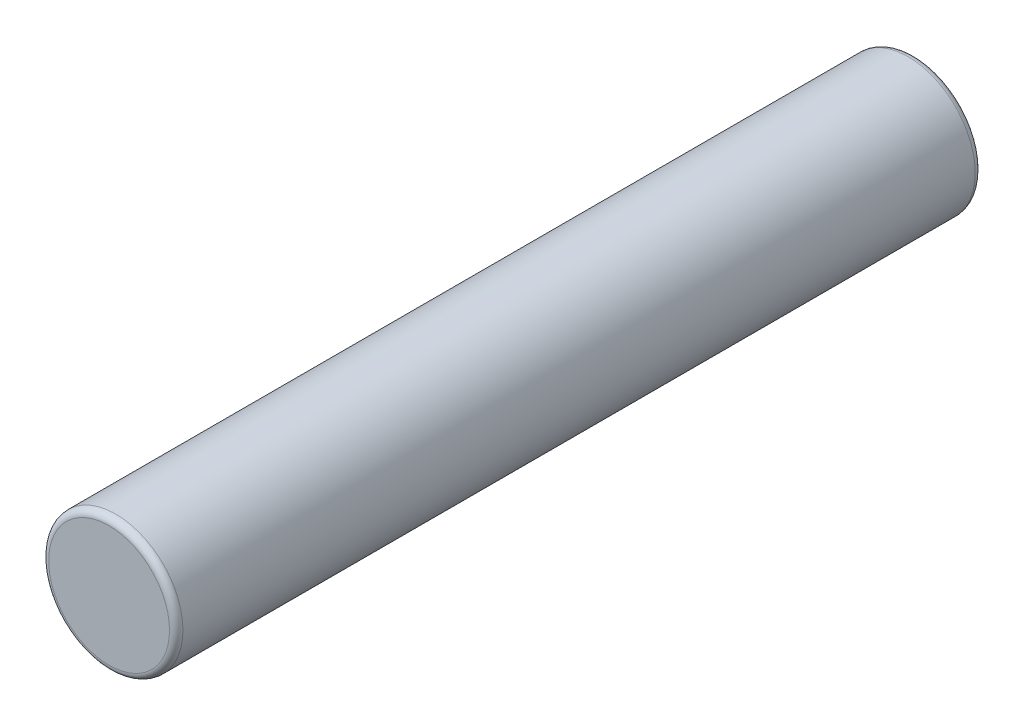
ISO-10303-21;
HEADER;
FILE_DESCRIPTION(('STEP AP214'),'2;1');
FILE_NAME('part.step','',(''),(''),'','','');
FILE_SCHEMA(('AUTOMOTIVE_DESIGN { 1 0 10303 214 1 1 1 1 }'));
ENDSEC;
DATA;
#1=APPLICATION_CONTEXT('core data for automotive mechanical design processes');
#2=APPLICATION_PROTOCOL_DEFINITION('international standard','automotive_design',2000,#1);
#3=PRODUCT_CONTEXT('',#1,'mechanical');
#4=PRODUCT('Part','Part','',(#3));
#5=PRODUCT_RELATED_PRODUCT_CATEGORY('part','',(#4));
#6=PRODUCT_DEFINITION_FORMATION('','',#4);
#7=PRODUCT_DEFINITION_CONTEXT('part definition',#1,'design');
#8=PRODUCT_DEFINITION('design','',#6,#7);
#9=PRODUCT_DEFINITION_SHAPE('','',#8);
#10=(LENGTH_UNIT() NAMED_UNIT(*) SI_UNIT(.MILLI.,.METRE.));
#11=(NAMED_UNIT(*) PLANE_ANGLE_UNIT() SI_UNIT($,.RADIAN.));
#12=(NAMED_UNIT(*) SI_UNIT($,.STERADIAN.) SOLID_ANGLE_UNIT());
#13=UNCERTAINTY_MEASURE_WITH_UNIT(LENGTH_MEASURE(1.E-05),#10,'distance_accuracy_value','');
#14=(GEOMETRIC_REPRESENTATION_CONTEXT(3) GLOBAL_UNCERTAINTY_ASSIGNED_CONTEXT((#13)) GLOBAL_UNIT_ASSIGNED_CONTEXT((#10,
#11,#12)) REPRESENTATION_CONTEXT('',''));
#15=CARTESIAN_POINT('',(0.,0.,0.));
#16=DIRECTION('',(0.,0.,1.));
#17=DIRECTION('',(1.,0.,0.));
#18=AXIS2_PLACEMENT_3D('',#15,#16,#17);
#19=CARTESIAN_POINT('',(0.,0.,12.));
#20=DIRECTION('',(0.,0.,-1.));
#21=DIRECTION('',(-1.,0.,0.));
#22=AXIS2_PLACEMENT_3D('',#19,#20,#21);
#23=CYLINDRICAL_SURFACE('',#22,1.);
#24=CARTESIAN_POINT('',(0.,0.,0.0999999999999994));
#25=DIRECTION('',(0.,0.,1.));
#26=DIRECTION('',(1.,0.,0.));
#27=AXIS2_PLACEMENT_3D('',#24,#25,#26);
#28=CIRCLE('',#27,1.);
#29=CARTESIAN_POINT('',(1.,0.,0.0999999999999994));
#30=VERTEX_POINT('',#29);
#31=EDGE_CURVE('E35',#30,#30,#28,.T.);
#32=ORIENTED_EDGE('',*,*,#31,.T.);
#33=EDGE_LOOP('',(#32));
#34=FACE_BOUND('',#33,.T.);
#35=CARTESIAN_POINT('',(0.,0.,11.9));
#36=DIRECTION('',(0.,0.,1.));
#37=DIRECTION('',(1.,0.,0.));
#38=AXIS2_PLACEMENT_3D('',#35,#36,#37);
#39=CIRCLE('',#38,1.);
#40=CARTESIAN_POINT('',(1.,0.,11.9));
#41=VERTEX_POINT('',#40);
#42=EDGE_CURVE('E39',#41,#41,#39,.F.);
#43=ORIENTED_EDGE('',*,*,#42,.T.);
#44=EDGE_LOOP('',(#43));
#45=FACE_BOUND('',#44,.T.);
#46=ADVANCED_FACE('F25',(#34,#45),#23,.T.);
#47=CARTESIAN_POINT('',(0.,0.,12.));
#48=DIRECTION('',(0.,0.,1.));
#49=DIRECTION('',(1.,0.,0.));
#50=AXIS2_PLACEMENT_3D('',#47,#48,#49);
#51=PLANE('',#50);
#52=CARTESIAN_POINT('',(0.,0.,12.));
#53=DIRECTION('',(0.,0.,1.));
#54=DIRECTION('',(1.,0.,0.));
#55=AXIS2_PLACEMENT_3D('',#52,#53,#54);
#56=CIRCLE('',#55,0.9);
#57=CARTESIAN_POINT('',(0.9,0.,12.));
#58=VERTEX_POINT('',#57);
#59=EDGE_CURVE('E10',#58,#58,#56,.T.);
#60=ORIENTED_EDGE('',*,*,#59,.T.);
#61=EDGE_LOOP('',(#60));
#62=FACE_BOUND('',#61,.T.);
#63=ADVANCED_FACE('F58',(#62),#51,.T.);
#64=CARTESIAN_POINT('',(0.,0.,0.));
#65=DIRECTION('',(0.,0.,1.));
#66=DIRECTION('',(1.,0.,0.));
#67=AXIS2_PLACEMENT_3D('',#64,#65,#66);
#68=PLANE('',#67);
#69=CARTESIAN_POINT('',(0.,0.,0.));
#70=DIRECTION('',(0.,0.,1.));
#71=DIRECTION('',(1.,0.,0.));
#72=AXIS2_PLACEMENT_3D('',#69,#70,#71);
#73=CIRCLE('',#72,0.9);
#74=CARTESIAN_POINT('',(0.9,0.,0.));
#75=VERTEX_POINT('',#74);
#76=EDGE_CURVE('E31',#75,#75,#73,.F.);
#77=ORIENTED_EDGE('',*,*,#76,.T.);
#78=EDGE_LOOP('',(#77));
#79=FACE_BOUND('',#78,.T.);
#80=ADVANCED_FACE('F54',(#79),#68,.F.);
#81=CARTESIAN_POINT('',(0.,0.,0.0999999999999994));
#82=DIRECTION('',(0.,0.,1.));
#83=DIRECTION('',(1.,0.,0.));
#84=AXIS2_PLACEMENT_3D('',#81,#82,#83);
#85=TOROIDAL_SURFACE('',#84,0.9,0.1);
#86=ORIENTED_EDGE('',*,*,#76,.F.);
#87=EDGE_LOOP('',(#86));
#88=FACE_BOUND('',#87,.T.);
#89=ORIENTED_EDGE('',*,*,#31,.F.);
#90=EDGE_LOOP('',(#89));
#91=FACE_BOUND('',#90,.T.);
#92=ADVANCED_FACE('F49',(#88,#91),#85,.T.);
#93=CARTESIAN_POINT('',(0.,0.,11.9));
#94=DIRECTION('',(0.,0.,1.));
#95=DIRECTION('',(1.,0.,0.));
#96=AXIS2_PLACEMENT_3D('',#93,#94,#95);
#97=TOROIDAL_SURFACE('',#96,0.9,0.1);
#98=ORIENTED_EDGE('',*,*,#42,.F.);
#99=EDGE_LOOP('',(#98));
#100=FACE_BOUND('',#99,.T.);
#101=ORIENTED_EDGE('',*,*,#59,.F.);
#102=EDGE_LOOP('',(#101));
#103=FACE_BOUND('',#102,.T.);
#104=ADVANCED_FACE('F46',(#100,#103),#97,.T.);
#105=CLOSED_SHELL('',(#46,#63,#80,#92,#104));
#106=MANIFOLD_SOLID_BREP('B2',#105);
#107=ADVANCED_BREP_SHAPE_REPRESENTATION('',(#18,#106),#14);
#108=SHAPE_DEFINITION_REPRESENTATION(#9,#107);
ENDSEC;
END-ISO-10303-21;
